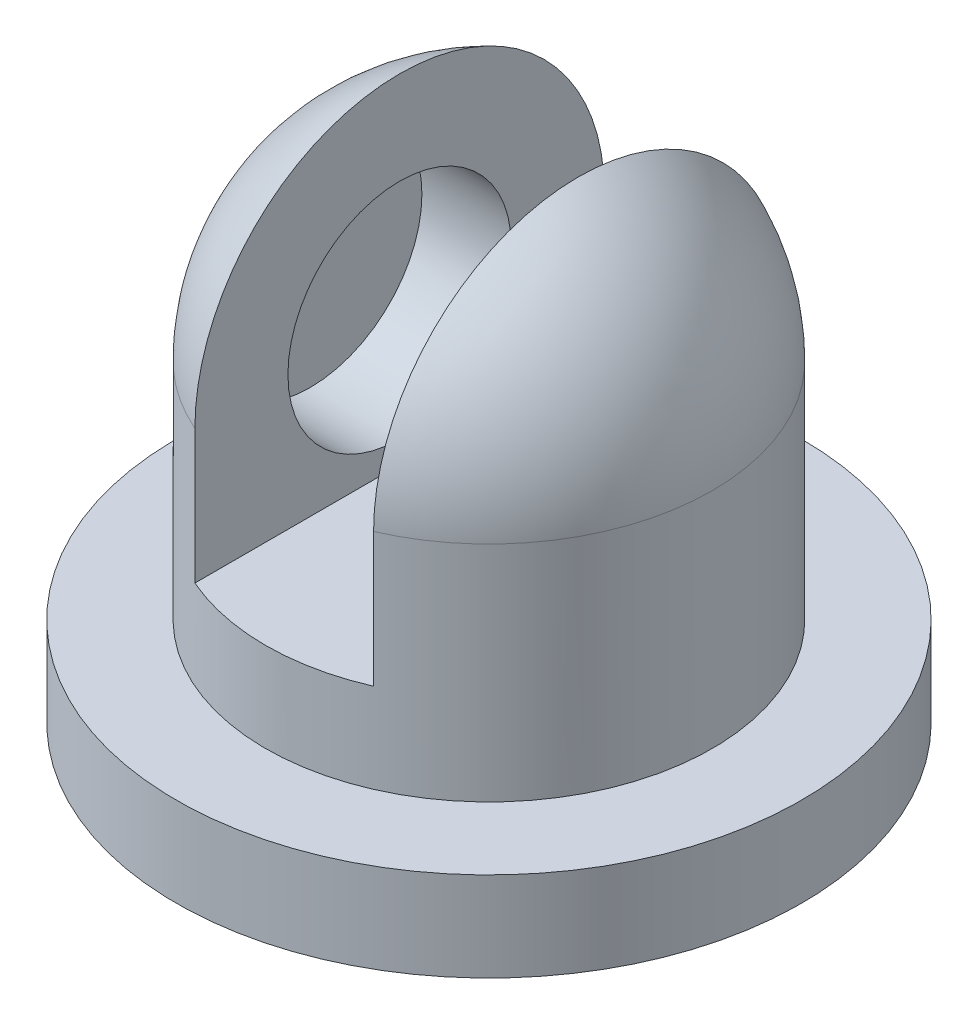
ISO-10303-21;
HEADER;
FILE_DESCRIPTION(('STEP AP214'),'2;1');
FILE_NAME('part.step','',(''),(''),'','','');
FILE_SCHEMA(('AUTOMOTIVE_DESIGN { 1 0 10303 214 1 1 1 1 }'));
ENDSEC;
DATA;
#1=APPLICATION_CONTEXT('core data for automotive mechanical design processes');
#2=APPLICATION_PROTOCOL_DEFINITION('international standard','automotive_design',2000,#1);
#3=PRODUCT_CONTEXT('',#1,'mechanical');
#4=PRODUCT('Part','Part','',(#3));
#5=PRODUCT_RELATED_PRODUCT_CATEGORY('part','',(#4));
#6=PRODUCT_DEFINITION_FORMATION('','',#4);
#7=PRODUCT_DEFINITION_CONTEXT('part definition',#1,'design');
#8=PRODUCT_DEFINITION('design','',#6,#7);
#9=PRODUCT_DEFINITION_SHAPE('','',#8);
#10=(LENGTH_UNIT() NAMED_UNIT(*) SI_UNIT(.MILLI.,.METRE.));
#11=(NAMED_UNIT(*) PLANE_ANGLE_UNIT() SI_UNIT($,.RADIAN.));
#12=(NAMED_UNIT(*) SI_UNIT($,.STERADIAN.) SOLID_ANGLE_UNIT());
#13=UNCERTAINTY_MEASURE_WITH_UNIT(LENGTH_MEASURE(1.E-05),#10,'distance_accuracy_value','');
#14=(GEOMETRIC_REPRESENTATION_CONTEXT(3) GLOBAL_UNCERTAINTY_ASSIGNED_CONTEXT((#13)) GLOBAL_UNIT_ASSIGNED_CONTEXT((#10,
#11,#12)) REPRESENTATION_CONTEXT('',''));
#15=CARTESIAN_POINT('',(0.,0.,0.));
#16=DIRECTION('',(0.,0.,1.));
#17=DIRECTION('',(1.,0.,0.));
#18=AXIS2_PLACEMENT_3D('',#15,#16,#17);
#19=CARTESIAN_POINT('',(-2.,-3.,-5.));
#20=DIRECTION('',(1.,0.,0.));
#21=DIRECTION('',(0.,0.,-1.));
#22=AXIS2_PLACEMENT_3D('',#19,#20,#21);
#23=PLANE('',#22);
#24=DIRECTION('',(0.,1.,0.));
#25=VECTOR('',#24,1.);
#26=CARTESIAN_POINT('',(-2.,-4.99999999999997,-4.58257569495588));
#27=LINE('',#26,#25);
#28=CARTESIAN_POINT('',(-2.,-3.,-4.58257569495586));
#29=VERTEX_POINT('',#28);
#30=CARTESIAN_POINT('',(-2.,0.,-4.58257569495584));
#31=VERTEX_POINT('',#30);
#32=EDGE_CURVE('E11',#29,#31,#27,.T.);
#33=ORIENTED_EDGE('',*,*,#32,.T.);
#34=CARTESIAN_POINT('',(-2.,0.,0.));
#35=DIRECTION('',(1.,0.,0.));
#36=DIRECTION('',(0.,0.,-1.));
#37=AXIS2_PLACEMENT_3D('',#34,#35,#36);
#38=CIRCLE('',#37,4.58257569495584);
#39=CARTESIAN_POINT('',(-2.,0.,4.58257569495584));
#40=VERTEX_POINT('',#39);
#41=EDGE_CURVE('E92',#31,#40,#38,.T.);
#42=ORIENTED_EDGE('',*,*,#41,.T.);
#43=DIRECTION('',(0.,1.,0.));
#44=VECTOR('',#43,1.);
#45=CARTESIAN_POINT('',(-2.,-5.00000000000003,4.5825756949558));
#46=LINE('',#45,#44);
#47=CARTESIAN_POINT('',(-2.,-3.,4.58257569495582));
#48=VERTEX_POINT('',#47);
#49=EDGE_CURVE('E43',#40,#48,#46,.F.);
#50=ORIENTED_EDGE('',*,*,#49,.T.);
#51=DIRECTION('',(0.,0.,-1.));
#52=VECTOR('',#51,1.);
#53=CARTESIAN_POINT('',(-2.,-3.,-5.));
#54=LINE('',#53,#52);
#55=EDGE_CURVE('E90',#48,#29,#54,.T.);
#56=ORIENTED_EDGE('',*,*,#55,.T.);
#57=EDGE_LOOP('',(#33,#42,#50,#56));
#58=FACE_BOUND('',#57,.T.);
#59=CARTESIAN_POINT('',(-2.,0.,0.));
#60=DIRECTION('',(-1.,0.,0.));
#61=DIRECTION('',(0.,0.,1.));
#62=AXIS2_PLACEMENT_3D('',#59,#60,#61);
#63=CIRCLE('',#62,2.5);
#64=CARTESIAN_POINT('',(-2.,0.,2.5));
#65=VERTEX_POINT('',#64);
#66=EDGE_CURVE('E100',#65,#65,#63,.T.);
#67=ORIENTED_EDGE('',*,*,#66,.T.);
#68=EDGE_LOOP('',(#67));
#69=FACE_BOUND('',#68,.T.);
#70=ADVANCED_FACE('F35',(#58,#69),#23,.T.);
#71=CARTESIAN_POINT('',(0.,0.,0.));
#72=DIRECTION('',(-1.,0.,0.));
#73=DIRECTION('',(0.,0.,1.));
#74=AXIS2_PLACEMENT_3D('',#71,#72,#73);
#75=SPHERICAL_SURFACE('',#74,5.);
#76=ORIENTED_EDGE('',*,*,#41,.F.);
#77=CARTESIAN_POINT('',(0.,0.,0.));
#78=DIRECTION('',(0.,-1.,0.));
#79=DIRECTION('',(0.,0.,1.));
#80=AXIS2_PLACEMENT_3D('',#77,#78,#79);
#81=CIRCLE('',#80,5.);
#82=EDGE_CURVE('E121',#40,#31,#81,.T.);
#83=ORIENTED_EDGE('',*,*,#82,.F.);
#84=EDGE_LOOP('',(#76,#83));
#85=FACE_BOUND('',#84,.T.);
#86=ADVANCED_FACE('F128',(#85),#75,.T.);
#87=CARTESIAN_POINT('',(0.,-5.,0.));
#88=DIRECTION('',(0.,1.,0.));
#89=DIRECTION('',(0.,0.,1.));
#90=AXIS2_PLACEMENT_3D('',#87,#88,#89);
#91=CYLINDRICAL_SURFACE('',#90,5.);
#92=CARTESIAN_POINT('',(0.,-5.,0.));
#93=DIRECTION('',(0.,-1.,0.));
#94=DIRECTION('',(0.,0.,-1.));
#95=AXIS2_PLACEMENT_3D('',#92,#93,#94);
#96=CIRCLE('',#95,5.);
#97=CARTESIAN_POINT('',(0.,-4.99999999999997,-5.00000000000003));
#98=VERTEX_POINT('',#97);
#99=EDGE_CURVE('E115',#98,#98,#96,.T.);
#100=ORIENTED_EDGE('',*,*,#99,.F.);
#101=EDGE_LOOP('',(#100));
#102=FACE_BOUND('',#101,.T.);
#103=ORIENTED_EDGE('',*,*,#32,.F.);
#104=CARTESIAN_POINT('',(0.,-3.,0.));
#105=DIRECTION('',(0.,1.,0.));
#106=DIRECTION('',(0.,0.,1.));
#107=AXIS2_PLACEMENT_3D('',#104,#105,#106);
#108=CIRCLE('',#107,5.);
#109=CARTESIAN_POINT('',(2.,-3.,-4.58257569495586));
#110=VERTEX_POINT('',#109);
#111=EDGE_CURVE('E86',#110,#29,#108,.T.);
#112=ORIENTED_EDGE('',*,*,#111,.F.);
#113=DIRECTION('',(0.,1.,0.));
#114=VECTOR('',#113,1.);
#115=CARTESIAN_POINT('',(2.,-4.99999999999997,-4.58257569495588));
#116=LINE('',#115,#114);
#117=CARTESIAN_POINT('',(2.,0.,-4.58257569495584));
#118=VERTEX_POINT('',#117);
#119=EDGE_CURVE('E84',#110,#118,#116,.T.);
#120=ORIENTED_EDGE('',*,*,#119,.T.);
#121=CARTESIAN_POINT('',(2.,0.,4.58257569495584));
#122=VERTEX_POINT('',#121);
#123=EDGE_CURVE('E120',#118,#122,#81,.T.);
#124=ORIENTED_EDGE('',*,*,#123,.T.);
#125=DIRECTION('',(0.,1.,0.));
#126=VECTOR('',#125,1.);
#127=CARTESIAN_POINT('',(2.,-5.00000000000003,4.5825756949558));
#128=LINE('',#127,#126);
#129=CARTESIAN_POINT('',(2.,-3.,4.58257569495582));
#130=VERTEX_POINT('',#129);
#131=EDGE_CURVE('E82',#122,#130,#128,.F.);
#132=ORIENTED_EDGE('',*,*,#131,.T.);
#133=EDGE_CURVE('E75',#48,#130,#108,.T.);
#134=ORIENTED_EDGE('',*,*,#133,.F.);
#135=ORIENTED_EDGE('',*,*,#49,.F.);
#136=ORIENTED_EDGE('',*,*,#82,.T.);
#137=EDGE_LOOP('',(#103,#112,#120,#124,#132,#134,#135,#136));
#138=FACE_BOUND('',#137,.T.);
#139=ADVANCED_FACE('F78',(#102,#138),#91,.T.);
#140=ORIENTED_EDGE('',*,*,#123,.F.);
#141=CARTESIAN_POINT('',(2.,0.,0.));
#142=DIRECTION('',(1.,0.,0.));
#143=DIRECTION('',(0.,0.,-1.));
#144=AXIS2_PLACEMENT_3D('',#141,#142,#143);
#145=CIRCLE('',#144,4.58257569495584);
#146=EDGE_CURVE('E57',#118,#122,#145,.T.);
#147=ORIENTED_EDGE('',*,*,#146,.T.);
#148=EDGE_LOOP('',(#140,#147));
#149=FACE_BOUND('',#148,.T.);
#150=ADVANCED_FACE('F37',(#149),#75,.T.);
#151=CARTESIAN_POINT('',(0.,-5.,0.));
#152=DIRECTION('',(0.,-1.,0.));
#153=DIRECTION('',(0.,0.,-1.));
#154=AXIS2_PLACEMENT_3D('',#151,#152,#153);
#155=PLANE('',#154);
#156=CARTESIAN_POINT('',(0.,-5.,0.));
#157=DIRECTION('',(0.,-1.,0.));
#158=DIRECTION('',(0.,0.,-1.));
#159=AXIS2_PLACEMENT_3D('',#156,#157,#158);
#160=CIRCLE('',#159,7.);
#161=CARTESIAN_POINT('',(0.,-4.99999999999995,-7.00000000000003));
#162=VERTEX_POINT('',#161);
#163=EDGE_CURVE('E111',#162,#162,#160,.T.);
#164=ORIENTED_EDGE('',*,*,#163,.F.);
#165=EDGE_LOOP('',(#164));
#166=FACE_BOUND('',#165,.T.);
#167=ORIENTED_EDGE('',*,*,#99,.T.);
#168=EDGE_LOOP('',(#167));
#169=FACE_BOUND('',#168,.T.);
#170=ADVANCED_FACE('F127',(#166,#169),#155,.F.);
#171=CARTESIAN_POINT('',(0.,-7.,0.));
#172=DIRECTION('',(0.,1.,0.));
#173=DIRECTION('',(0.,0.,1.));
#174=AXIS2_PLACEMENT_3D('',#171,#172,#173);
#175=CYLINDRICAL_SURFACE('',#174,7.);
#176=CARTESIAN_POINT('',(0.,-7.,0.));
#177=DIRECTION('',(0.,-1.,0.));
#178=DIRECTION('',(0.,0.,-1.));
#179=AXIS2_PLACEMENT_3D('',#176,#177,#178);
#180=CIRCLE('',#179,7.);
#181=CARTESIAN_POINT('',(0.,-6.99999999999995,-7.00000000000005));
#182=VERTEX_POINT('',#181);
#183=EDGE_CURVE('E112',#182,#182,#180,.T.);
#184=ORIENTED_EDGE('',*,*,#183,.F.);
#185=EDGE_LOOP('',(#184));
#186=FACE_BOUND('',#185,.T.);
#187=ORIENTED_EDGE('',*,*,#163,.T.);
#188=EDGE_LOOP('',(#187));
#189=FACE_BOUND('',#188,.T.);
#190=ADVANCED_FACE('F133',(#186,#189),#175,.T.);
#191=CARTESIAN_POINT('',(0.,-7.,0.));
#192=DIRECTION('',(0.,-1.,0.));
#193=DIRECTION('',(0.,0.,-1.));
#194=AXIS2_PLACEMENT_3D('',#191,#192,#193);
#195=PLANE('',#194);
#196=ORIENTED_EDGE('',*,*,#183,.T.);
#197=EDGE_LOOP('',(#196));
#198=FACE_BOUND('',#197,.T.);
#199=ADVANCED_FACE('F160',(#198),#195,.T.);
#200=CARTESIAN_POINT('',(2.,-3.,-5.));
#201=DIRECTION('',(1.,0.,0.));
#202=DIRECTION('',(0.,0.,-1.));
#203=AXIS2_PLACEMENT_3D('',#200,#201,#202);
#204=PLANE('',#203);
#205=CARTESIAN_POINT('',(2.,0.,0.));
#206=DIRECTION('',(-1.,0.,0.));
#207=DIRECTION('',(0.,0.,1.));
#208=AXIS2_PLACEMENT_3D('',#205,#206,#207);
#209=CIRCLE('',#208,2.5);
#210=CARTESIAN_POINT('',(2.,0.,2.5));
#211=VERTEX_POINT('',#210);
#212=EDGE_CURVE('E97',#211,#211,#209,.T.);
#213=ORIENTED_EDGE('',*,*,#212,.F.);
#214=EDGE_LOOP('',(#213));
#215=FACE_BOUND('',#214,.T.);
#216=DIRECTION('',(0.,0.,-1.));
#217=VECTOR('',#216,1.);
#218=CARTESIAN_POINT('',(2.,-3.,-5.));
#219=LINE('',#218,#217);
#220=EDGE_CURVE('E50',#130,#110,#219,.T.);
#221=ORIENTED_EDGE('',*,*,#220,.F.);
#222=ORIENTED_EDGE('',*,*,#131,.F.);
#223=ORIENTED_EDGE('',*,*,#146,.F.);
#224=ORIENTED_EDGE('',*,*,#119,.F.);
#225=EDGE_LOOP('',(#221,#222,#223,#224));
#226=FACE_BOUND('',#225,.T.);
#227=ADVANCED_FACE('F157',(#215,#226),#204,.F.);
#228=CARTESIAN_POINT('',(0.,-3.,0.));
#229=DIRECTION('',(0.,1.,0.));
#230=DIRECTION('',(0.,0.,1.));
#231=AXIS2_PLACEMENT_3D('',#228,#229,#230);
#232=PLANE('',#231);
#233=ORIENTED_EDGE('',*,*,#133,.T.);
#234=ORIENTED_EDGE('',*,*,#220,.T.);
#235=ORIENTED_EDGE('',*,*,#111,.T.);
#236=ORIENTED_EDGE('',*,*,#55,.F.);
#237=EDGE_LOOP('',(#233,#234,#235,#236));
#238=FACE_BOUND('',#237,.T.);
#239=ADVANCED_FACE('F93',(#238),#232,.T.);
#240=CARTESIAN_POINT('',(4.,0.,0.));
#241=DIRECTION('',(-1.,0.,0.));
#242=DIRECTION('',(0.,0.,1.));
#243=AXIS2_PLACEMENT_3D('',#240,#241,#242);
#244=CYLINDRICAL_SURFACE('',#243,2.5);
#245=CARTESIAN_POINT('',(4.,0.,0.));
#246=DIRECTION('',(-1.,0.,0.));
#247=DIRECTION('',(0.,0.,1.));
#248=AXIS2_PLACEMENT_3D('',#245,#246,#247);
#249=CIRCLE('',#248,2.5);
#250=CARTESIAN_POINT('',(4.,0.,2.5));
#251=VERTEX_POINT('',#250);
#252=EDGE_CURVE('E104',#251,#251,#249,.T.);
#253=ORIENTED_EDGE('',*,*,#252,.F.);
#254=EDGE_LOOP('',(#253));
#255=FACE_BOUND('',#254,.T.);
#256=ORIENTED_EDGE('',*,*,#212,.T.);
#257=EDGE_LOOP('',(#256));
#258=FACE_BOUND('',#257,.T.);
#259=ADVANCED_FACE('F150',(#255,#258),#244,.F.);
#260=CARTESIAN_POINT('',(4.,0.,0.));
#261=DIRECTION('',(-1.,0.,0.));
#262=DIRECTION('',(0.,0.,1.));
#263=AXIS2_PLACEMENT_3D('',#260,#261,#262);
#264=PLANE('',#263);
#265=ORIENTED_EDGE('',*,*,#252,.T.);
#266=EDGE_LOOP('',(#265));
#267=FACE_BOUND('',#266,.T.);
#268=ADVANCED_FACE('F147',(#267),#264,.T.);
#269=CARTESIAN_POINT('',(-4.,0.,0.));
#270=DIRECTION('',(1.,0.,0.));
#271=DIRECTION('',(0.,0.,-1.));
#272=AXIS2_PLACEMENT_3D('',#269,#270,#271);
#273=CYLINDRICAL_SURFACE('',#272,2.5);
#274=CARTESIAN_POINT('',(-4.,0.,0.));
#275=DIRECTION('',(-1.,0.,0.));
#276=DIRECTION('',(0.,0.,1.));
#277=AXIS2_PLACEMENT_3D('',#274,#275,#276);
#278=CIRCLE('',#277,2.5);
#279=CARTESIAN_POINT('',(-4.,0.,2.5));
#280=VERTEX_POINT('',#279);
#281=EDGE_CURVE('E95',#280,#280,#278,.T.);
#282=ORIENTED_EDGE('',*,*,#281,.T.);
#283=EDGE_LOOP('',(#282));
#284=FACE_BOUND('',#283,.T.);
#285=ORIENTED_EDGE('',*,*,#66,.F.);
#286=EDGE_LOOP('',(#285));
#287=FACE_BOUND('',#286,.T.);
#288=ADVANCED_FACE('F145',(#284,#287),#273,.F.);
#289=CARTESIAN_POINT('',(-4.,0.,0.));
#290=DIRECTION('',(1.,0.,0.));
#291=DIRECTION('',(0.,0.,1.));
#292=AXIS2_PLACEMENT_3D('',#289,#290,#291);
#293=PLANE('',#292);
#294=ORIENTED_EDGE('',*,*,#281,.F.);
#295=EDGE_LOOP('',(#294));
#296=FACE_BOUND('',#295,.T.);
#297=ADVANCED_FACE('F203',(#296),#293,.T.);
#298=CLOSED_SHELL('',(#70,#86,#139,#150,#170,#190,#199,#227,#239,#259,#268,#288,#297));
#299=MANIFOLD_SOLID_BREP('B2',#298);
#300=ADVANCED_BREP_SHAPE_REPRESENTATION('',(#18,#299),#14);
#301=SHAPE_DEFINITION_REPRESENTATION(#9,#300);
ENDSEC;
END-ISO-10303-21;
